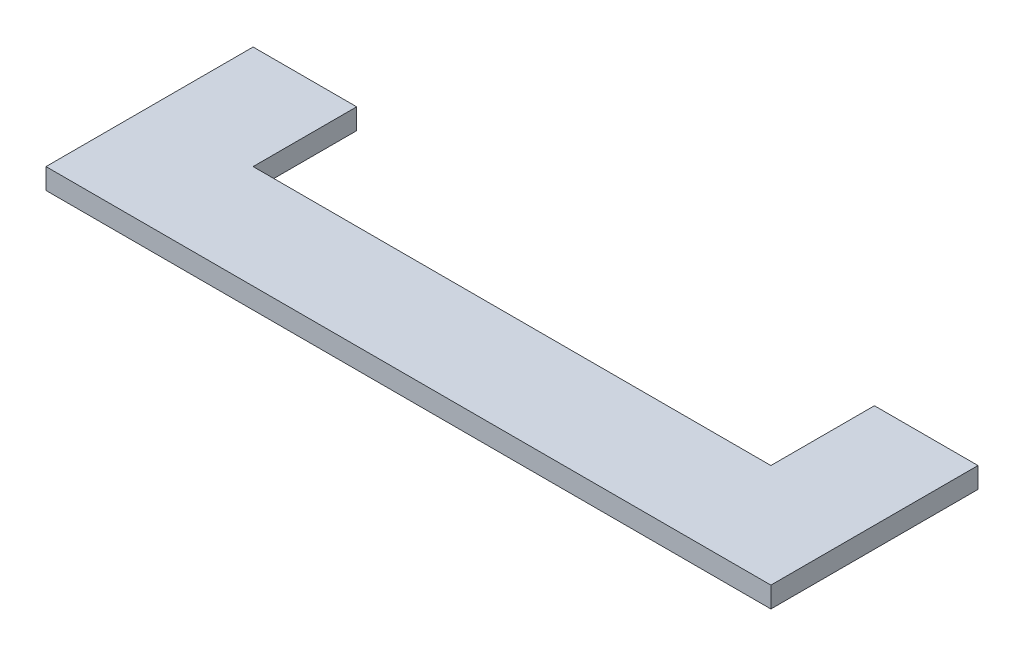
ISO-10303-21;
HEADER;
FILE_DESCRIPTION(('STEP AP214'),'2;1');
FILE_NAME('part.step','',(''),(''),'','','');
FILE_SCHEMA(('AUTOMOTIVE_DESIGN { 1 0 10303 214 1 1 1 1 }'));
ENDSEC;
DATA;
#1=APPLICATION_CONTEXT('core data for automotive mechanical design processes');
#2=APPLICATION_PROTOCOL_DEFINITION('international standard','automotive_design',2000,#1);
#3=PRODUCT_CONTEXT('',#1,'mechanical');
#4=PRODUCT('Part','Part','',(#3));
#5=PRODUCT_RELATED_PRODUCT_CATEGORY('part','',(#4));
#6=PRODUCT_DEFINITION_FORMATION('','',#4);
#7=PRODUCT_DEFINITION_CONTEXT('part definition',#1,'design');
#8=PRODUCT_DEFINITION('design','',#6,#7);
#9=PRODUCT_DEFINITION_SHAPE('','',#8);
#10=(LENGTH_UNIT() NAMED_UNIT(*) SI_UNIT(.MILLI.,.METRE.));
#11=(NAMED_UNIT(*) PLANE_ANGLE_UNIT() SI_UNIT($,.RADIAN.));
#12=(NAMED_UNIT(*) SI_UNIT($,.STERADIAN.) SOLID_ANGLE_UNIT());
#13=UNCERTAINTY_MEASURE_WITH_UNIT(LENGTH_MEASURE(1.E-05),#10,'distance_accuracy_value','');
#14=(GEOMETRIC_REPRESENTATION_CONTEXT(3) GLOBAL_UNCERTAINTY_ASSIGNED_CONTEXT((#13)) GLOBAL_UNIT_ASSIGNED_CONTEXT((#10,
#11,#12)) REPRESENTATION_CONTEXT('',''));
#15=CARTESIAN_POINT('',(0.,0.,0.));
#16=DIRECTION('',(0.,0.,1.));
#17=DIRECTION('',(1.,0.,0.));
#18=AXIS2_PLACEMENT_3D('',#15,#16,#17);
#19=CARTESIAN_POINT('',(75.0000000000001,6.,0.));
#20=DIRECTION('',(-1.,0.,0.));
#21=DIRECTION('',(0.,0.,1.));
#22=AXIS2_PLACEMENT_3D('',#19,#20,#21);
#23=PLANE('',#22);
#24=DIRECTION('',(0.,0.,-1.));
#25=VECTOR('',#24,1.);
#26=CARTESIAN_POINT('',(75.0000000000001,0.,0.));
#27=LINE('',#26,#25);
#28=CARTESIAN_POINT('',(75.,0.,79.0000000000324));
#29=VERTEX_POINT('',#28);
#30=CARTESIAN_POINT('',(75.,0.,49.));
#31=VERTEX_POINT('',#30);
#32=EDGE_CURVE('E128',#29,#31,#27,.T.);
#33=ORIENTED_EDGE('',*,*,#32,.F.);
#34=DIRECTION('',(0.,-1.,0.));
#35=VECTOR('',#34,1.);
#36=CARTESIAN_POINT('',(75.,6.,79.0000000000324));
#37=LINE('',#36,#35);
#38=CARTESIAN_POINT('',(75.,6.,79.0000000000324));
#39=VERTEX_POINT('',#38);
#40=EDGE_CURVE('E11',#39,#29,#37,.T.);
#41=ORIENTED_EDGE('',*,*,#40,.F.);
#42=DIRECTION('',(0.,0.,-1.));
#43=VECTOR('',#42,1.);
#44=CARTESIAN_POINT('',(75.0000000000001,6.,0.));
#45=LINE('',#44,#43);
#46=CARTESIAN_POINT('',(75.,6.,49.));
#47=VERTEX_POINT('',#46);
#48=EDGE_CURVE('E146',#39,#47,#45,.T.);
#49=ORIENTED_EDGE('',*,*,#48,.T.);
#50=DIRECTION('',(0.,-1.,0.));
#51=VECTOR('',#50,1.);
#52=CARTESIAN_POINT('',(75.,6.,49.));
#53=LINE('',#52,#51);
#54=EDGE_CURVE('E86',#47,#31,#53,.T.);
#55=ORIENTED_EDGE('',*,*,#54,.T.);
#56=EDGE_LOOP('',(#33,#41,#49,#55));
#57=FACE_BOUND('',#56,.T.);
#58=ADVANCED_FACE('F35',(#57),#23,.T.);
#59=CARTESIAN_POINT('',(0.,6.,79.0000000000324));
#60=DIRECTION('',(0.,0.,-1.));
#61=DIRECTION('',(-1.,0.,0.));
#62=AXIS2_PLACEMENT_3D('',#59,#60,#61);
#63=PLANE('',#62);
#64=DIRECTION('',(1.,0.,0.));
#65=VECTOR('',#64,1.);
#66=CARTESIAN_POINT('',(0.,0.,79.0000000000324));
#67=LINE('',#66,#65);
#68=CARTESIAN_POINT('',(-75.,0.,79.0000000000324));
#69=VERTEX_POINT('',#68);
#70=EDGE_CURVE('E131',#69,#29,#67,.T.);
#71=ORIENTED_EDGE('',*,*,#70,.F.);
#72=DIRECTION('',(0.,-1.,0.));
#73=VECTOR('',#72,1.);
#74=CARTESIAN_POINT('',(-75.,6.,79.0000000000324));
#75=LINE('',#74,#73);
#76=CARTESIAN_POINT('',(-75.,6.,79.0000000000324));
#77=VERTEX_POINT('',#76);
#78=EDGE_CURVE('E43',#77,#69,#75,.T.);
#79=ORIENTED_EDGE('',*,*,#78,.F.);
#80=DIRECTION('',(1.,0.,0.));
#81=VECTOR('',#80,1.);
#82=CARTESIAN_POINT('',(0.,6.,79.0000000000324));
#83=LINE('',#82,#81);
#84=EDGE_CURVE('E172',#77,#39,#83,.T.);
#85=ORIENTED_EDGE('',*,*,#84,.T.);
#86=ORIENTED_EDGE('',*,*,#40,.T.);
#87=EDGE_LOOP('',(#71,#79,#85,#86));
#88=FACE_BOUND('',#87,.T.);
#89=ADVANCED_FACE('F163',(#88),#63,.T.);
#90=CARTESIAN_POINT('',(-75.,6.,0.));
#91=DIRECTION('',(1.,0.,0.));
#92=DIRECTION('',(0.,0.,-1.));
#93=AXIS2_PLACEMENT_3D('',#90,#91,#92);
#94=PLANE('',#93);
#95=DIRECTION('',(0.,0.,1.));
#96=VECTOR('',#95,1.);
#97=CARTESIAN_POINT('',(-75.,0.,0.));
#98=LINE('',#97,#96);
#99=CARTESIAN_POINT('',(-75.,0.,49.));
#100=VERTEX_POINT('',#99);
#101=EDGE_CURVE('E134',#100,#69,#98,.T.);
#102=ORIENTED_EDGE('',*,*,#101,.F.);
#103=DIRECTION('',(0.,-1.,0.));
#104=VECTOR('',#103,1.);
#105=CARTESIAN_POINT('',(-75.,6.,49.));
#106=LINE('',#105,#104);
#107=CARTESIAN_POINT('',(-75.,6.,49.));
#108=VERTEX_POINT('',#107);
#109=EDGE_CURVE('E152',#108,#100,#106,.T.);
#110=ORIENTED_EDGE('',*,*,#109,.F.);
#111=DIRECTION('',(0.,0.,1.));
#112=VECTOR('',#111,1.);
#113=CARTESIAN_POINT('',(-75.,6.,0.));
#114=LINE('',#113,#112);
#115=EDGE_CURVE('E159',#108,#77,#114,.T.);
#116=ORIENTED_EDGE('',*,*,#115,.T.);
#117=ORIENTED_EDGE('',*,*,#78,.T.);
#118=EDGE_LOOP('',(#102,#110,#116,#117));
#119=FACE_BOUND('',#118,.T.);
#120=ADVANCED_FACE('F157',(#119),#94,.T.);
#121=CARTESIAN_POINT('',(0.,6.,49.));
#122=DIRECTION('',(0.,0.,-1.));
#123=DIRECTION('',(-1.,0.,0.));
#124=AXIS2_PLACEMENT_3D('',#121,#122,#123);
#125=PLANE('',#124);
#126=DIRECTION('',(1.,0.,0.));
#127=VECTOR('',#126,1.);
#128=CARTESIAN_POINT('',(0.,0.,49.));
#129=LINE('',#128,#127);
#130=CARTESIAN_POINT('',(-105.,0.,49.));
#131=VERTEX_POINT('',#130);
#132=EDGE_CURVE('E137',#131,#100,#129,.T.);
#133=ORIENTED_EDGE('',*,*,#132,.F.);
#134=DIRECTION('',(0.,-1.,0.));
#135=VECTOR('',#134,1.);
#136=CARTESIAN_POINT('',(-105.,6.,49.));
#137=LINE('',#136,#135);
#138=CARTESIAN_POINT('',(-105.,6.,49.));
#139=VERTEX_POINT('',#138);
#140=EDGE_CURVE('E150',#139,#131,#137,.T.);
#141=ORIENTED_EDGE('',*,*,#140,.F.);
#142=DIRECTION('',(1.,0.,0.));
#143=VECTOR('',#142,1.);
#144=CARTESIAN_POINT('',(0.,6.,49.));
#145=LINE('',#144,#143);
#146=EDGE_CURVE('E171',#139,#108,#145,.T.);
#147=ORIENTED_EDGE('',*,*,#146,.T.);
#148=ORIENTED_EDGE('',*,*,#109,.T.);
#149=EDGE_LOOP('',(#133,#141,#147,#148));
#150=FACE_BOUND('',#149,.T.);
#151=ADVANCED_FACE('F169',(#150),#125,.T.);
#152=CARTESIAN_POINT('',(-105.,6.,0.));
#153=DIRECTION('',(1.,0.,0.));
#154=DIRECTION('',(0.,0.,-1.));
#155=AXIS2_PLACEMENT_3D('',#152,#153,#154);
#156=PLANE('',#155);
#157=DIRECTION('',(0.,0.,1.));
#158=VECTOR('',#157,1.);
#159=CARTESIAN_POINT('',(-105.,0.,0.));
#160=LINE('',#159,#158);
#161=CARTESIAN_POINT('',(-105.,0.,109.000000000001));
#162=VERTEX_POINT('',#161);
#163=EDGE_CURVE('E140',#131,#162,#160,.T.);
#164=ORIENTED_EDGE('',*,*,#163,.T.);
#165=DIRECTION('',(0.,-1.,0.));
#166=VECTOR('',#165,1.);
#167=CARTESIAN_POINT('',(-105.,6.,109.000000000001));
#168=LINE('',#167,#166);
#169=CARTESIAN_POINT('',(-105.,6.,109.000000000001));
#170=VERTEX_POINT('',#169);
#171=EDGE_CURVE('E120',#170,#162,#168,.T.);
#172=ORIENTED_EDGE('',*,*,#171,.F.);
#173=DIRECTION('',(0.,0.,1.));
#174=VECTOR('',#173,1.);
#175=CARTESIAN_POINT('',(-105.,6.,0.));
#176=LINE('',#175,#174);
#177=EDGE_CURVE('E111',#139,#170,#176,.T.);
#178=ORIENTED_EDGE('',*,*,#177,.F.);
#179=ORIENTED_EDGE('',*,*,#140,.T.);
#180=EDGE_LOOP('',(#164,#172,#178,#179));
#181=FACE_BOUND('',#180,.T.);
#182=ADVANCED_FACE('F188',(#181),#156,.F.);
#183=CARTESIAN_POINT('',(0.,6.,109.000000000001));
#184=DIRECTION('',(0.,0.,-1.));
#185=DIRECTION('',(-1.,0.,0.));
#186=AXIS2_PLACEMENT_3D('',#183,#184,#185);
#187=PLANE('',#186);
#188=DIRECTION('',(1.,0.,0.));
#189=VECTOR('',#188,1.);
#190=CARTESIAN_POINT('',(0.,0.,109.000000000001));
#191=LINE('',#190,#189);
#192=CARTESIAN_POINT('',(105.,0.,109.000000000001));
#193=VERTEX_POINT('',#192);
#194=EDGE_CURVE('E119',#162,#193,#191,.T.);
#195=ORIENTED_EDGE('',*,*,#194,.T.);
#196=DIRECTION('',(0.,-1.,0.));
#197=VECTOR('',#196,1.);
#198=CARTESIAN_POINT('',(105.,6.,109.000000000001));
#199=LINE('',#198,#197);
#200=CARTESIAN_POINT('',(105.,6.,109.000000000001));
#201=VERTEX_POINT('',#200);
#202=EDGE_CURVE('E116',#201,#193,#199,.T.);
#203=ORIENTED_EDGE('',*,*,#202,.F.);
#204=DIRECTION('',(1.,0.,0.));
#205=VECTOR('',#204,1.);
#206=CARTESIAN_POINT('',(0.,6.,109.000000000001));
#207=LINE('',#206,#205);
#208=EDGE_CURVE('E104',#170,#201,#207,.T.);
#209=ORIENTED_EDGE('',*,*,#208,.F.);
#210=ORIENTED_EDGE('',*,*,#171,.T.);
#211=EDGE_LOOP('',(#195,#203,#209,#210));
#212=FACE_BOUND('',#211,.T.);
#213=ADVANCED_FACE('F117',(#212),#187,.F.);
#214=CARTESIAN_POINT('',(105.,6.,0.));
#215=DIRECTION('',(-1.,0.,0.));
#216=DIRECTION('',(0.,0.,1.));
#217=AXIS2_PLACEMENT_3D('',#214,#215,#216);
#218=PLANE('',#217);
#219=DIRECTION('',(0.,0.,-1.));
#220=VECTOR('',#219,1.);
#221=CARTESIAN_POINT('',(105.,0.,0.));
#222=LINE('',#221,#220);
#223=CARTESIAN_POINT('',(105.,0.,49.));
#224=VERTEX_POINT('',#223);
#225=EDGE_CURVE('E79',#193,#224,#222,.T.);
#226=ORIENTED_EDGE('',*,*,#225,.T.);
#227=DIRECTION('',(0.,-1.,0.));
#228=VECTOR('',#227,1.);
#229=CARTESIAN_POINT('',(105.,6.,49.));
#230=LINE('',#229,#228);
#231=CARTESIAN_POINT('',(105.,6.,49.));
#232=VERTEX_POINT('',#231);
#233=EDGE_CURVE('E121',#232,#224,#230,.T.);
#234=ORIENTED_EDGE('',*,*,#233,.F.);
#235=DIRECTION('',(0.,0.,-1.));
#236=VECTOR('',#235,1.);
#237=CARTESIAN_POINT('',(105.,6.,0.));
#238=LINE('',#237,#236);
#239=EDGE_CURVE('E108',#201,#232,#238,.T.);
#240=ORIENTED_EDGE('',*,*,#239,.F.);
#241=ORIENTED_EDGE('',*,*,#202,.T.);
#242=EDGE_LOOP('',(#226,#234,#240,#241));
#243=FACE_BOUND('',#242,.T.);
#244=ADVANCED_FACE('F123',(#243),#218,.F.);
#245=CARTESIAN_POINT('',(0.,6.,49.));
#246=DIRECTION('',(0.,0.,1.));
#247=DIRECTION('',(1.,0.,0.));
#248=AXIS2_PLACEMENT_3D('',#245,#246,#247);
#249=PLANE('',#248);
#250=DIRECTION('',(-1.,0.,0.));
#251=VECTOR('',#250,1.);
#252=CARTESIAN_POINT('',(0.,0.,49.));
#253=LINE('',#252,#251);
#254=EDGE_CURVE('E144',#224,#31,#253,.T.);
#255=ORIENTED_EDGE('',*,*,#254,.T.);
#256=ORIENTED_EDGE('',*,*,#54,.F.);
#257=DIRECTION('',(-1.,0.,0.));
#258=VECTOR('',#257,1.);
#259=CARTESIAN_POINT('',(0.,6.,49.));
#260=LINE('',#259,#258);
#261=EDGE_CURVE('E51',#232,#47,#260,.T.);
#262=ORIENTED_EDGE('',*,*,#261,.F.);
#263=ORIENTED_EDGE('',*,*,#233,.T.);
#264=EDGE_LOOP('',(#255,#256,#262,#263));
#265=FACE_BOUND('',#264,.T.);
#266=ADVANCED_FACE('F196',(#265),#249,.F.);
#267=CARTESIAN_POINT('',(0.,6.,0.));
#268=DIRECTION('',(0.,1.,0.));
#269=DIRECTION('',(0.,0.,1.));
#270=AXIS2_PLACEMENT_3D('',#267,#268,#269);
#271=PLANE('',#270);
#272=ORIENTED_EDGE('',*,*,#48,.F.);
#273=ORIENTED_EDGE('',*,*,#84,.F.);
#274=ORIENTED_EDGE('',*,*,#115,.F.);
#275=ORIENTED_EDGE('',*,*,#146,.F.);
#276=ORIENTED_EDGE('',*,*,#177,.T.);
#277=ORIENTED_EDGE('',*,*,#208,.T.);
#278=ORIENTED_EDGE('',*,*,#239,.T.);
#279=ORIENTED_EDGE('',*,*,#261,.T.);
#280=EDGE_LOOP('',(#272,#273,#274,#275,#276,#277,#278,#279));
#281=FACE_BOUND('',#280,.T.);
#282=ADVANCED_FACE('F106',(#281),#271,.T.);
#283=CARTESIAN_POINT('',(0.,0.,0.));
#284=DIRECTION('',(0.,1.,0.));
#285=DIRECTION('',(0.,0.,1.));
#286=AXIS2_PLACEMENT_3D('',#283,#284,#285);
#287=PLANE('',#286);
#288=ORIENTED_EDGE('',*,*,#32,.T.);
#289=ORIENTED_EDGE('',*,*,#254,.F.);
#290=ORIENTED_EDGE('',*,*,#225,.F.);
#291=ORIENTED_EDGE('',*,*,#194,.F.);
#292=ORIENTED_EDGE('',*,*,#163,.F.);
#293=ORIENTED_EDGE('',*,*,#132,.T.);
#294=ORIENTED_EDGE('',*,*,#101,.T.);
#295=ORIENTED_EDGE('',*,*,#70,.T.);
#296=EDGE_LOOP('',(#288,#289,#290,#291,#292,#293,#294,#295));
#297=FACE_BOUND('',#296,.T.);
#298=ADVANCED_FACE('F165',(#297),#287,.F.);
#299=CLOSED_SHELL('',(#58,#89,#120,#151,#182,#213,#244,#266,#282,#298));
#300=MANIFOLD_SOLID_BREP('B2',#299);
#301=ADVANCED_BREP_SHAPE_REPRESENTATION('',(#18,#300),#14);
#302=SHAPE_DEFINITION_REPRESENTATION(#9,#301);
ENDSEC;
END-ISO-10303-21;
